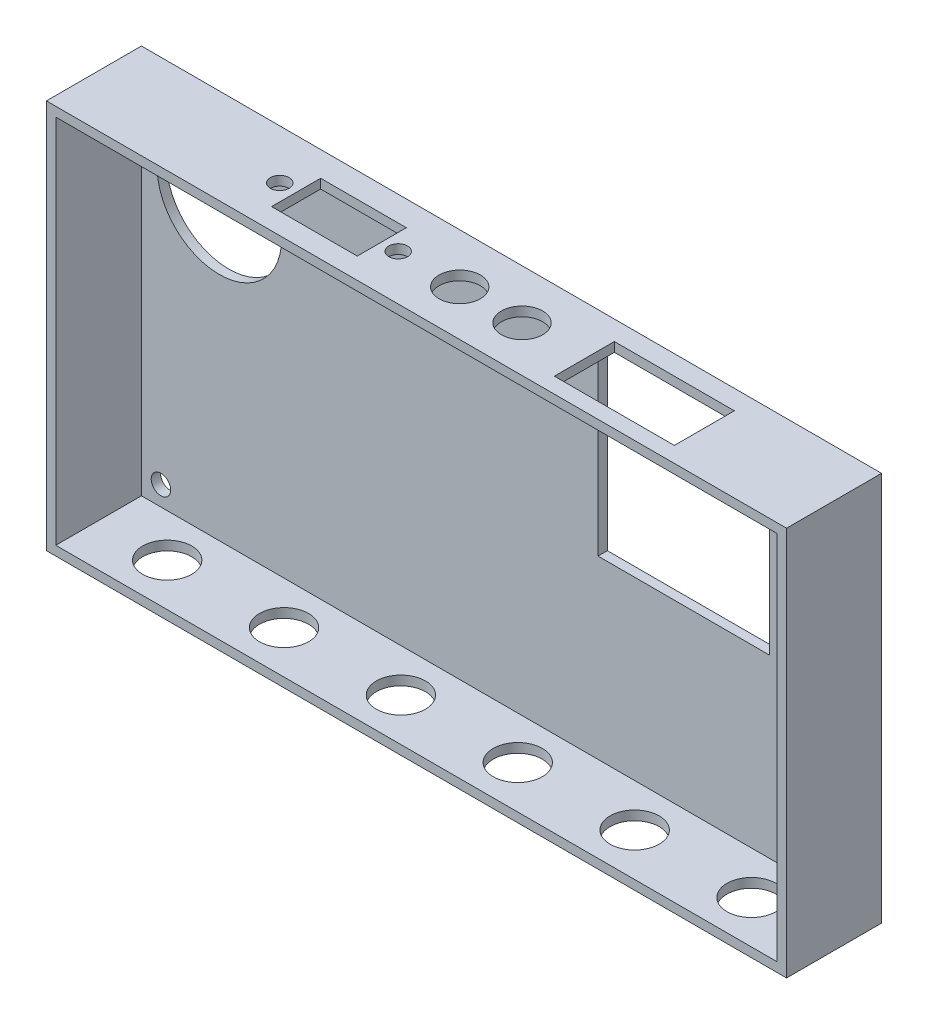
ISO-10303-21;
HEADER;
FILE_DESCRIPTION(('STEP AP214'),'2;1');
FILE_NAME('part.step','',(''),(''),'','','');
FILE_SCHEMA(('AUTOMOTIVE_DESIGN { 1 0 10303 214 1 1 1 1 }'));
ENDSEC;
DATA;
#1=APPLICATION_CONTEXT('core data for automotive mechanical design processes');
#2=APPLICATION_PROTOCOL_DEFINITION('international standard','automotive_design',2000,#1);
#3=PRODUCT_CONTEXT('',#1,'mechanical');
#4=PRODUCT('Part','Part','',(#3));
#5=PRODUCT_RELATED_PRODUCT_CATEGORY('part','',(#4));
#6=PRODUCT_DEFINITION_FORMATION('','',#4);
#7=PRODUCT_DEFINITION_CONTEXT('part definition',#1,'design');
#8=PRODUCT_DEFINITION('design','',#6,#7);
#9=PRODUCT_DEFINITION_SHAPE('','',#8);
#10=(LENGTH_UNIT() NAMED_UNIT(*) SI_UNIT(.MILLI.,.METRE.));
#11=(NAMED_UNIT(*) PLANE_ANGLE_UNIT() SI_UNIT($,.RADIAN.));
#12=(NAMED_UNIT(*) SI_UNIT($,.STERADIAN.) SOLID_ANGLE_UNIT());
#13=UNCERTAINTY_MEASURE_WITH_UNIT(LENGTH_MEASURE(1.E-05),#10,'distance_accuracy_value','');
#14=(GEOMETRIC_REPRESENTATION_CONTEXT(3) GLOBAL_UNCERTAINTY_ASSIGNED_CONTEXT((#13)) GLOBAL_UNIT_ASSIGNED_CONTEXT((#10,
#11,#12)) REPRESENTATION_CONTEXT('',''));
#15=CARTESIAN_POINT('',(0.,0.,0.));
#16=DIRECTION('',(0.,0.,1.));
#17=DIRECTION('',(1.,0.,0.));
#18=AXIS2_PLACEMENT_3D('',#15,#16,#17);
#19=CARTESIAN_POINT('',(0.,0.,1.2));
#20=DIRECTION('',(0.,0.,-1.));
#21=DIRECTION('',(-1.,0.,0.));
#22=AXIS2_PLACEMENT_3D('',#19,#20,#21);
#23=PLANE('',#22);
#24=CARTESIAN_POINT('',(11.2,-11.2,1.2));
#25=DIRECTION('',(0.,0.,1.));
#26=DIRECTION('',(1.,0.,0.));
#27=AXIS2_PLACEMENT_3D('',#24,#25,#26);
#28=CIRCLE('',#27,8.);
#29=CARTESIAN_POINT('',(19.2,-11.2,1.2));
#30=VERTEX_POINT('',#29);
#31=EDGE_CURVE('E353',#30,#30,#28,.T.);
#32=ORIENTED_EDGE('',*,*,#31,.F.);
#33=EDGE_LOOP('',(#32));
#34=FACE_BOUND('',#33,.T.);
#35=CARTESIAN_POINT('',(3.69999999999999,-46.3,1.2));
#36=DIRECTION('',(0.,0.,1.));
#37=DIRECTION('',(1.,0.,0.));
#38=AXIS2_PLACEMENT_3D('',#35,#36,#37);
#39=CIRCLE('',#38,1.25);
#40=CARTESIAN_POINT('',(4.94999999999999,-46.3,1.2));
#41=VERTEX_POINT('',#40);
#42=EDGE_CURVE('E385',#41,#41,#39,.T.);
#43=ORIENTED_EDGE('',*,*,#42,.F.);
#44=EDGE_LOOP('',(#43));
#45=FACE_BOUND('',#44,.T.);
#46=CARTESIAN_POINT('',(91.2999999999998,-46.3,1.2));
#47=DIRECTION('',(0.,0.,1.));
#48=DIRECTION('',(1.,0.,0.));
#49=AXIS2_PLACEMENT_3D('',#46,#47,#48);
#50=CIRCLE('',#49,1.25);
#51=CARTESIAN_POINT('',(92.5499999999998,-46.3,1.2));
#52=VERTEX_POINT('',#51);
#53=EDGE_CURVE('E379',#52,#52,#50,.T.);
#54=ORIENTED_EDGE('',*,*,#53,.F.);
#55=EDGE_LOOP('',(#54));
#56=FACE_BOUND('',#55,.T.);
#57=CARTESIAN_POINT('',(91.2999999999998,-3.7,1.2));
#58=DIRECTION('',(0.,0.,1.));
#59=DIRECTION('',(1.,0.,0.));
#60=AXIS2_PLACEMENT_3D('',#57,#58,#59);
#61=CIRCLE('',#60,1.25);
#62=CARTESIAN_POINT('',(92.5499999999998,-3.7,1.2));
#63=VERTEX_POINT('',#62);
#64=EDGE_CURVE('E373',#63,#63,#61,.T.);
#65=ORIENTED_EDGE('',*,*,#64,.F.);
#66=EDGE_LOOP('',(#65));
#67=FACE_BOUND('',#66,.T.);
#68=CARTESIAN_POINT('',(3.69999999999999,-3.7,1.2));
#69=DIRECTION('',(0.,0.,1.));
#70=DIRECTION('',(1.,0.,0.));
#71=AXIS2_PLACEMENT_3D('',#68,#69,#70);
#72=CIRCLE('',#71,1.2);
#73=CARTESIAN_POINT('',(4.9,-3.7,1.2));
#74=VERTEX_POINT('',#73);
#75=EDGE_CURVE('E190',#74,#74,#72,.T.);
#76=ORIENTED_EDGE('',*,*,#75,.F.);
#77=EDGE_LOOP('',(#76));
#78=FACE_BOUND('',#77,.T.);
#79=DIRECTION('',(0.,-1.,0.));
#80=VECTOR('',#79,1.);
#81=CARTESIAN_POINT('',(59.7999999999998,0.,1.2));
#82=LINE('',#81,#80);
#83=CARTESIAN_POINT('',(59.7999999999998,-1.2,1.2));
#84=VERTEX_POINT('',#83);
#85=CARTESIAN_POINT('',(59.7999999999998,-26.2,1.2));
#86=VERTEX_POINT('',#85);
#87=EDGE_CURVE('E352',#84,#86,#82,.T.);
#88=ORIENTED_EDGE('',*,*,#87,.F.);
#89=DIRECTION('',(-1.,0.,0.));
#90=VECTOR('',#89,1.);
#91=CARTESIAN_POINT('',(1.2,-1.2,1.2));
#92=LINE('',#91,#90);
#93=CARTESIAN_POINT('',(1.2,-1.2,1.2));
#94=VERTEX_POINT('',#93);
#95=EDGE_CURVE('E202',#84,#94,#92,.T.);
#96=ORIENTED_EDGE('',*,*,#95,.T.);
#97=DIRECTION('',(0.,-1.,0.));
#98=VECTOR('',#97,1.);
#99=CARTESIAN_POINT('',(1.2,-1.2,1.2));
#100=LINE('',#99,#98);
#101=CARTESIAN_POINT('',(1.19999999999982,-48.8,1.2));
#102=VERTEX_POINT('',#101);
#103=EDGE_CURVE('E320',#94,#102,#100,.T.);
#104=ORIENTED_EDGE('',*,*,#103,.T.);
#105=DIRECTION('',(1.,0.,0.));
#106=VECTOR('',#105,1.);
#107=CARTESIAN_POINT('',(1.19999999999982,-48.8,1.2));
#108=LINE('',#107,#106);
#109=CARTESIAN_POINT('',(93.7999999999998,-48.8,1.2));
#110=VERTEX_POINT('',#109);
#111=EDGE_CURVE('E333',#102,#110,#108,.T.);
#112=ORIENTED_EDGE('',*,*,#111,.T.);
#113=DIRECTION('',(0.,1.,0.));
#114=VECTOR('',#113,1.);
#115=CARTESIAN_POINT('',(93.7999999999997,-1.2,1.2));
#116=LINE('',#115,#114);
#117=CARTESIAN_POINT('',(93.7999999999997,-1.2,1.2));
#118=VERTEX_POINT('',#117);
#119=EDGE_CURVE('E200',#110,#118,#116,.T.);
#120=ORIENTED_EDGE('',*,*,#119,.T.);
#121=CARTESIAN_POINT('',(81.7999999999998,-1.2,1.2));
#122=VERTEX_POINT('',#121);
#123=EDGE_CURVE('E183',#118,#122,#92,.T.);
#124=ORIENTED_EDGE('',*,*,#123,.T.);
#125=DIRECTION('',(0.,-1.,0.));
#126=VECTOR('',#125,1.);
#127=CARTESIAN_POINT('',(81.7999999999998,0.,1.2));
#128=LINE('',#127,#126);
#129=CARTESIAN_POINT('',(81.7999999999998,-26.2,1.2));
#130=VERTEX_POINT('',#129);
#131=EDGE_CURVE('E193',#122,#130,#128,.T.);
#132=ORIENTED_EDGE('',*,*,#131,.T.);
#133=DIRECTION('',(-1.,0.,0.));
#134=VECTOR('',#133,1.);
#135=CARTESIAN_POINT('',(0.,-26.2,1.2));
#136=LINE('',#135,#134);
#137=EDGE_CURVE('E56',#130,#86,#136,.T.);
#138=ORIENTED_EDGE('',*,*,#137,.T.);
#139=EDGE_LOOP('',(#88,#96,#104,#112,#120,#124,#132,#138));
#140=FACE_BOUND('',#139,.T.);
#141=ADVANCED_FACE('F39',(#34,#45,#56,#67,#78,#140),#23,.F.);
#142=CARTESIAN_POINT('',(0.,0.,12.2));
#143=DIRECTION('',(0.,0.,1.));
#144=DIRECTION('',(1.,0.,0.));
#145=AXIS2_PLACEMENT_3D('',#142,#143,#144);
#146=PLANE('',#145);
#147=DIRECTION('',(0.,-1.,0.));
#148=VECTOR('',#147,1.);
#149=CARTESIAN_POINT('',(0.,0.,12.2));
#150=LINE('',#149,#148);
#151=CARTESIAN_POINT('',(0.,0.,12.2));
#152=VERTEX_POINT('',#151);
#153=CARTESIAN_POINT('',(-1.85676297188408E-13,-50.,12.2));
#154=VERTEX_POINT('',#153);
#155=EDGE_CURVE('E220',#152,#154,#150,.T.);
#156=ORIENTED_EDGE('',*,*,#155,.T.);
#157=DIRECTION('',(1.,0.,0.));
#158=VECTOR('',#157,1.);
#159=CARTESIAN_POINT('',(-1.85676297188408E-13,-50.,12.2));
#160=LINE('',#159,#158);
#161=CARTESIAN_POINT('',(94.9999999999998,-50.,12.2));
#162=VERTEX_POINT('',#161);
#163=EDGE_CURVE('E223',#154,#162,#160,.T.);
#164=ORIENTED_EDGE('',*,*,#163,.T.);
#165=DIRECTION('',(0.,1.,0.));
#166=VECTOR('',#165,1.);
#167=CARTESIAN_POINT('',(94.9999999999997,0.,12.2));
#168=LINE('',#167,#166);
#169=CARTESIAN_POINT('',(94.9999999999997,0.,12.2));
#170=VERTEX_POINT('',#169);
#171=EDGE_CURVE('E225',#162,#170,#168,.T.);
#172=ORIENTED_EDGE('',*,*,#171,.T.);
#173=DIRECTION('',(-1.,0.,0.));
#174=VECTOR('',#173,1.);
#175=CARTESIAN_POINT('',(0.,0.,12.2));
#176=LINE('',#175,#174);
#177=EDGE_CURVE('E227',#170,#152,#176,.T.);
#178=ORIENTED_EDGE('',*,*,#177,.T.);
#179=EDGE_LOOP('',(#156,#164,#172,#178));
#180=FACE_BOUND('',#179,.T.);
#181=DIRECTION('',(1.,0.,0.));
#182=VECTOR('',#181,1.);
#183=CARTESIAN_POINT('',(1.19999999999982,-48.8,12.2));
#184=LINE('',#183,#182);
#185=CARTESIAN_POINT('',(1.19999999999982,-48.8,12.2));
#186=VERTEX_POINT('',#185);
#187=CARTESIAN_POINT('',(93.7999999999998,-48.8,12.2));
#188=VERTEX_POINT('',#187);
#189=EDGE_CURVE('E204',#186,#188,#184,.T.);
#190=ORIENTED_EDGE('',*,*,#189,.F.);
#191=DIRECTION('',(0.,-1.,0.));
#192=VECTOR('',#191,1.);
#193=CARTESIAN_POINT('',(1.2,-1.2,12.2));
#194=LINE('',#193,#192);
#195=CARTESIAN_POINT('',(1.2,-1.2,12.2));
#196=VERTEX_POINT('',#195);
#197=EDGE_CURVE('E201',#196,#186,#194,.T.);
#198=ORIENTED_EDGE('',*,*,#197,.F.);
#199=DIRECTION('',(-1.,0.,0.));
#200=VECTOR('',#199,1.);
#201=CARTESIAN_POINT('',(1.2,-1.2,12.2));
#202=LINE('',#201,#200);
#203=CARTESIAN_POINT('',(93.7999999999997,-1.2,12.2));
#204=VERTEX_POINT('',#203);
#205=EDGE_CURVE('E213',#204,#196,#202,.T.);
#206=ORIENTED_EDGE('',*,*,#205,.F.);
#207=DIRECTION('',(0.,1.,0.));
#208=VECTOR('',#207,1.);
#209=CARTESIAN_POINT('',(93.7999999999997,-1.2,12.2));
#210=LINE('',#209,#208);
#211=EDGE_CURVE('E328',#188,#204,#210,.T.);
#212=ORIENTED_EDGE('',*,*,#211,.F.);
#213=EDGE_LOOP('',(#190,#198,#206,#212));
#214=FACE_BOUND('',#213,.T.);
#215=ADVANCED_FACE('F346',(#180,#214),#146,.T.);
#216=CARTESIAN_POINT('',(0.,0.,12.2));
#217=DIRECTION('',(1.,0.,0.));
#218=DIRECTION('',(0.,1.,0.));
#219=AXIS2_PLACEMENT_3D('',#216,#217,#218);
#220=PLANE('',#219);
#221=DIRECTION('',(0.,0.,-1.));
#222=VECTOR('',#221,1.);
#223=CARTESIAN_POINT('',(0.,0.,12.2));
#224=LINE('',#223,#222);
#225=CARTESIAN_POINT('',(-1.85676297188408E-13,0.,0.));
#226=VERTEX_POINT('',#225);
#227=EDGE_CURVE('E229',#152,#226,#224,.T.);
#228=ORIENTED_EDGE('',*,*,#227,.T.);
#229=DIRECTION('',(0.,1.,0.));
#230=VECTOR('',#229,1.);
#231=CARTESIAN_POINT('',(-1.85676297188408E-13,-50.,0.));
#232=LINE('',#231,#230);
#233=CARTESIAN_POINT('',(-1.85676297188408E-13,-50.,0.));
#234=VERTEX_POINT('',#233);
#235=EDGE_CURVE('E387',#234,#226,#232,.T.);
#236=ORIENTED_EDGE('',*,*,#235,.F.);
#237=DIRECTION('',(0.,0.,-1.));
#238=VECTOR('',#237,1.);
#239=CARTESIAN_POINT('',(-1.85676297188408E-13,-50.,12.2));
#240=LINE('',#239,#238);
#241=EDGE_CURVE('E12',#154,#234,#240,.T.);
#242=ORIENTED_EDGE('',*,*,#241,.F.);
#243=ORIENTED_EDGE('',*,*,#155,.F.);
#244=EDGE_LOOP('',(#228,#236,#242,#243));
#245=FACE_BOUND('',#244,.T.);
#246=ADVANCED_FACE('F41',(#245),#220,.F.);
#247=CARTESIAN_POINT('',(-1.85676297188408E-13,-50.,12.2));
#248=DIRECTION('',(0.,1.,0.));
#249=DIRECTION('',(-1.,0.,0.));
#250=AXIS2_PLACEMENT_3D('',#247,#248,#249);
#251=PLANE('',#250);
#252=CARTESIAN_POINT('',(9.99999999999966,-50.,6.7));
#253=DIRECTION('',(0.,-1.,0.));
#254=DIRECTION('',(0.,0.,-1.));
#255=AXIS2_PLACEMENT_3D('',#252,#253,#254);
#256=CIRCLE('',#255,3.15);
#257=CARTESIAN_POINT('',(9.99999999999966,-50.,3.55));
#258=VERTEX_POINT('',#257);
#259=EDGE_CURVE('E400',#258,#258,#256,.T.);
#260=ORIENTED_EDGE('',*,*,#259,.F.);
#261=EDGE_LOOP('',(#260));
#262=FACE_BOUND('',#261,.T.);
#263=CARTESIAN_POINT('',(84.9999999999997,-50.,6.70000000000001));
#264=DIRECTION('',(0.,-1.,0.));
#265=DIRECTION('',(0.,0.,-1.));
#266=AXIS2_PLACEMENT_3D('',#263,#264,#265);
#267=CIRCLE('',#266,3.15);
#268=CARTESIAN_POINT('',(84.9999999999997,-50.,3.55000000000001));
#269=VERTEX_POINT('',#268);
#270=EDGE_CURVE('E410',#269,#269,#267,.T.);
#271=ORIENTED_EDGE('',*,*,#270,.F.);
#272=EDGE_LOOP('',(#271));
#273=FACE_BOUND('',#272,.T.);
#274=CARTESIAN_POINT('',(69.9999999999997,-50.,6.7));
#275=DIRECTION('',(0.,-1.,0.));
#276=DIRECTION('',(0.,0.,-1.));
#277=AXIS2_PLACEMENT_3D('',#274,#275,#276);
#278=CIRCLE('',#277,3.15);
#279=CARTESIAN_POINT('',(69.9999999999997,-50.,3.55));
#280=VERTEX_POINT('',#279);
#281=EDGE_CURVE('E407',#280,#280,#278,.T.);
#282=ORIENTED_EDGE('',*,*,#281,.F.);
#283=EDGE_LOOP('',(#282));
#284=FACE_BOUND('',#283,.T.);
#285=CARTESIAN_POINT('',(54.9999999999997,-50.,6.7));
#286=DIRECTION('',(0.,-1.,0.));
#287=DIRECTION('',(0.,0.,-1.));
#288=AXIS2_PLACEMENT_3D('',#285,#286,#287);
#289=CIRCLE('',#288,3.15);
#290=CARTESIAN_POINT('',(54.9999999999997,-50.,3.55));
#291=VERTEX_POINT('',#290);
#292=EDGE_CURVE('E404',#291,#291,#289,.T.);
#293=ORIENTED_EDGE('',*,*,#292,.F.);
#294=EDGE_LOOP('',(#293));
#295=FACE_BOUND('',#294,.T.);
#296=CARTESIAN_POINT('',(39.9999999999997,-50.,6.7));
#297=DIRECTION('',(0.,-1.,0.));
#298=DIRECTION('',(0.,0.,-1.));
#299=AXIS2_PLACEMENT_3D('',#296,#297,#298);
#300=CIRCLE('',#299,3.15);
#301=CARTESIAN_POINT('',(39.9999999999997,-50.,3.55));
#302=VERTEX_POINT('',#301);
#303=EDGE_CURVE('E401',#302,#302,#300,.T.);
#304=ORIENTED_EDGE('',*,*,#303,.F.);
#305=EDGE_LOOP('',(#304));
#306=FACE_BOUND('',#305,.T.);
#307=CARTESIAN_POINT('',(24.9999999999997,-50.,6.7));
#308=DIRECTION('',(0.,-1.,0.));
#309=DIRECTION('',(0.,0.,-1.));
#310=AXIS2_PLACEMENT_3D('',#307,#308,#309);
#311=CIRCLE('',#310,3.15);
#312=CARTESIAN_POINT('',(24.9999999999997,-50.,3.55));
#313=VERTEX_POINT('',#312);
#314=EDGE_CURVE('E238',#313,#313,#311,.T.);
#315=ORIENTED_EDGE('',*,*,#314,.F.);
#316=EDGE_LOOP('',(#315));
#317=FACE_BOUND('',#316,.T.);
#318=ORIENTED_EDGE('',*,*,#241,.T.);
#319=DIRECTION('',(-1.,0.,0.));
#320=VECTOR('',#319,1.);
#321=CARTESIAN_POINT('',(-1.85676297188408E-13,-50.,0.));
#322=LINE('',#321,#320);
#323=CARTESIAN_POINT('',(94.9999999999997,-50.,0.));
#324=VERTEX_POINT('',#323);
#325=EDGE_CURVE('E397',#324,#234,#322,.T.);
#326=ORIENTED_EDGE('',*,*,#325,.F.);
#327=DIRECTION('',(0.,0.,-1.));
#328=VECTOR('',#327,1.);
#329=CARTESIAN_POINT('',(94.9999999999998,-50.,12.2));
#330=LINE('',#329,#328);
#331=EDGE_CURVE('E48',#162,#324,#330,.T.);
#332=ORIENTED_EDGE('',*,*,#331,.F.);
#333=ORIENTED_EDGE('',*,*,#163,.F.);
#334=EDGE_LOOP('',(#318,#326,#332,#333));
#335=FACE_BOUND('',#334,.T.);
#336=ADVANCED_FACE('F561',(#262,#273,#284,#295,#306,#317,#335),#251,.F.);
#337=CARTESIAN_POINT('',(94.9999999999997,0.,12.2));
#338=DIRECTION('',(-1.,0.,0.));
#339=DIRECTION('',(0.,-1.,0.));
#340=AXIS2_PLACEMENT_3D('',#337,#338,#339);
#341=PLANE('',#340);
#342=ORIENTED_EDGE('',*,*,#331,.T.);
#343=DIRECTION('',(0.,-1.,0.));
#344=VECTOR('',#343,1.);
#345=CARTESIAN_POINT('',(94.9999999999997,-50.,0.));
#346=LINE('',#345,#344);
#347=CARTESIAN_POINT('',(94.9999999999997,0.,0.));
#348=VERTEX_POINT('',#347);
#349=EDGE_CURVE('E394',#348,#324,#346,.T.);
#350=ORIENTED_EDGE('',*,*,#349,.F.);
#351=DIRECTION('',(0.,0.,-1.));
#352=VECTOR('',#351,1.);
#353=CARTESIAN_POINT('',(94.9999999999997,0.,12.2));
#354=LINE('',#353,#352);
#355=EDGE_CURVE('E231',#170,#348,#354,.T.);
#356=ORIENTED_EDGE('',*,*,#355,.F.);
#357=ORIENTED_EDGE('',*,*,#171,.F.);
#358=EDGE_LOOP('',(#342,#350,#356,#357));
#359=FACE_BOUND('',#358,.T.);
#360=ADVANCED_FACE('F551',(#359),#341,.F.);
#361=CARTESIAN_POINT('',(0.,0.,12.2));
#362=DIRECTION('',(0.,-1.,0.));
#363=DIRECTION('',(1.,0.,0.));
#364=AXIS2_PLACEMENT_3D('',#361,#362,#363);
#365=PLANE('',#364);
#366=CARTESIAN_POINT('',(47.2,0.,6.35));
#367=DIRECTION('',(0.,-1.,0.));
#368=DIRECTION('',(0.,0.,-1.));
#369=AXIS2_PLACEMENT_3D('',#366,#367,#368);
#370=CIRCLE('',#369,2.65);
#371=CARTESIAN_POINT('',(47.2,0.,3.7));
#372=VERTEX_POINT('',#371);
#373=EDGE_CURVE('E294',#372,#372,#370,.T.);
#374=ORIENTED_EDGE('',*,*,#373,.T.);
#375=EDGE_LOOP('',(#374));
#376=FACE_BOUND('',#375,.T.);
#377=CARTESIAN_POINT('',(55.2,0.,6.35));
#378=DIRECTION('',(0.,-1.,0.));
#379=DIRECTION('',(0.,0.,-1.));
#380=AXIS2_PLACEMENT_3D('',#377,#378,#379);
#381=CIRCLE('',#380,2.65);
#382=CARTESIAN_POINT('',(55.2,0.,3.7));
#383=VERTEX_POINT('',#382);
#384=EDGE_CURVE('E422',#383,#383,#381,.T.);
#385=ORIENTED_EDGE('',*,*,#384,.T.);
#386=EDGE_LOOP('',(#385));
#387=FACE_BOUND('',#386,.T.);
#388=DIRECTION('',(-1.,0.,0.));
#389=VECTOR('',#388,1.);
#390=CARTESIAN_POINT('',(63.2,0.,10.2));
#391=LINE('',#390,#389);
#392=CARTESIAN_POINT('',(78.6,0.,10.2));
#393=VERTEX_POINT('',#392);
#394=CARTESIAN_POINT('',(63.2,0.,10.2));
#395=VERTEX_POINT('',#394);
#396=EDGE_CURVE('E263',#393,#395,#391,.T.);
#397=ORIENTED_EDGE('',*,*,#396,.T.);
#398=DIRECTION('',(0.,0.,-1.));
#399=VECTOR('',#398,1.);
#400=CARTESIAN_POINT('',(63.2,0.,2.5));
#401=LINE('',#400,#399);
#402=CARTESIAN_POINT('',(63.2,0.,2.5));
#403=VERTEX_POINT('',#402);
#404=EDGE_CURVE('E271',#395,#403,#401,.T.);
#405=ORIENTED_EDGE('',*,*,#404,.T.);
#406=DIRECTION('',(1.,0.,0.));
#407=VECTOR('',#406,1.);
#408=CARTESIAN_POINT('',(63.2,0.,2.5));
#409=LINE('',#408,#407);
#410=CARTESIAN_POINT('',(78.6,0.,2.5));
#411=VERTEX_POINT('',#410);
#412=EDGE_CURVE('E429',#403,#411,#409,.T.);
#413=ORIENTED_EDGE('',*,*,#412,.T.);
#414=DIRECTION('',(0.,0.,1.));
#415=VECTOR('',#414,1.);
#416=CARTESIAN_POINT('',(78.6,0.,2.5));
#417=LINE('',#416,#415);
#418=EDGE_CURVE('E431',#411,#393,#417,.T.);
#419=ORIENTED_EDGE('',*,*,#418,.T.);
#420=EDGE_LOOP('',(#397,#405,#413,#419));
#421=FACE_BOUND('',#420,.T.);
#422=CARTESIAN_POINT('',(39.3,0.,6.35));
#423=DIRECTION('',(0.,-1.,0.));
#424=DIRECTION('',(0.,0.,-1.));
#425=AXIS2_PLACEMENT_3D('',#422,#423,#424);
#426=CIRCLE('',#425,1.20000000000001);
#427=CARTESIAN_POINT('',(39.3,0.,5.14999999999999));
#428=VERTEX_POINT('',#427);
#429=EDGE_CURVE('E288',#428,#428,#426,.T.);
#430=ORIENTED_EDGE('',*,*,#429,.T.);
#431=EDGE_LOOP('',(#430));
#432=FACE_BOUND('',#431,.T.);
#433=CARTESIAN_POINT('',(24.1,0.,6.35));
#434=DIRECTION('',(0.,-1.,0.));
#435=DIRECTION('',(0.,0.,-1.));
#436=AXIS2_PLACEMENT_3D('',#433,#434,#435);
#437=CIRCLE('',#436,1.2);
#438=CARTESIAN_POINT('',(24.1,0.,5.15));
#439=VERTEX_POINT('',#438);
#440=EDGE_CURVE('E281',#439,#439,#437,.T.);
#441=ORIENTED_EDGE('',*,*,#440,.T.);
#442=EDGE_LOOP('',(#441));
#443=FACE_BOUND('',#442,.T.);
#444=DIRECTION('',(-1.,0.,0.));
#445=VECTOR('',#444,1.);
#446=CARTESIAN_POINT('',(26.2,0.,9.5));
#447=LINE('',#446,#445);
#448=CARTESIAN_POINT('',(37.2,0.,9.5));
#449=VERTEX_POINT('',#448);
#450=CARTESIAN_POINT('',(26.2,0.,9.5));
#451=VERTEX_POINT('',#450);
#452=EDGE_CURVE('E305',#449,#451,#447,.T.);
#453=ORIENTED_EDGE('',*,*,#452,.T.);
#454=DIRECTION('',(0.,0.,-1.));
#455=VECTOR('',#454,1.);
#456=CARTESIAN_POINT('',(26.2,0.,3.2));
#457=LINE('',#456,#455);
#458=CARTESIAN_POINT('',(26.2,0.,3.2));
#459=VERTEX_POINT('',#458);
#460=EDGE_CURVE('E295',#451,#459,#457,.T.);
#461=ORIENTED_EDGE('',*,*,#460,.T.);
#462=DIRECTION('',(1.,0.,0.));
#463=VECTOR('',#462,1.);
#464=CARTESIAN_POINT('',(26.2,0.,3.2));
#465=LINE('',#464,#463);
#466=CARTESIAN_POINT('',(37.2,0.,3.2));
#467=VERTEX_POINT('',#466);
#468=EDGE_CURVE('E298',#459,#467,#465,.T.);
#469=ORIENTED_EDGE('',*,*,#468,.T.);
#470=DIRECTION('',(0.,0.,1.));
#471=VECTOR('',#470,1.);
#472=CARTESIAN_POINT('',(37.2,0.,3.2));
#473=LINE('',#472,#471);
#474=EDGE_CURVE('E302',#467,#449,#473,.T.);
#475=ORIENTED_EDGE('',*,*,#474,.T.);
#476=EDGE_LOOP('',(#453,#461,#469,#475));
#477=FACE_BOUND('',#476,.T.);
#478=ORIENTED_EDGE('',*,*,#355,.T.);
#479=DIRECTION('',(1.,0.,0.));
#480=VECTOR('',#479,1.);
#481=CARTESIAN_POINT('',(-1.85676297188408E-13,0.,0.));
#482=LINE('',#481,#480);
#483=EDGE_CURVE('E391',#226,#348,#482,.T.);
#484=ORIENTED_EDGE('',*,*,#483,.F.);
#485=ORIENTED_EDGE('',*,*,#227,.F.);
#486=ORIENTED_EDGE('',*,*,#177,.F.);
#487=EDGE_LOOP('',(#478,#484,#485,#486));
#488=FACE_BOUND('',#487,.T.);
#489=ADVANCED_FACE('F436',(#376,#387,#421,#432,#443,#477,#488),#365,.F.);
#490=CARTESIAN_POINT('',(1.2,-1.2,12.2));
#491=DIRECTION('',(1.,0.,0.));
#492=DIRECTION('',(0.,1.,0.));
#493=AXIS2_PLACEMENT_3D('',#490,#491,#492);
#494=PLANE('',#493);
#495=ORIENTED_EDGE('',*,*,#103,.F.);
#496=DIRECTION('',(0.,0.,-1.));
#497=VECTOR('',#496,1.);
#498=CARTESIAN_POINT('',(1.2,-1.2,12.2));
#499=LINE('',#498,#497);
#500=EDGE_CURVE('E209',#196,#94,#499,.T.);
#501=ORIENTED_EDGE('',*,*,#500,.F.);
#502=ORIENTED_EDGE('',*,*,#197,.T.);
#503=DIRECTION('',(0.,0.,-1.));
#504=VECTOR('',#503,1.);
#505=CARTESIAN_POINT('',(1.19999999999982,-48.8,12.2));
#506=LINE('',#505,#504);
#507=EDGE_CURVE('E217',#186,#102,#506,.T.);
#508=ORIENTED_EDGE('',*,*,#507,.T.);
#509=EDGE_LOOP('',(#495,#501,#502,#508));
#510=FACE_BOUND('',#509,.T.);
#511=ADVANCED_FACE('F341',(#510),#494,.T.);
#512=CARTESIAN_POINT('',(1.19999999999982,-48.8,12.2));
#513=DIRECTION('',(0.,1.,0.));
#514=DIRECTION('',(0.,0.,1.));
#515=AXIS2_PLACEMENT_3D('',#512,#513,#514);
#516=PLANE('',#515);
#517=CARTESIAN_POINT('',(9.99999999999966,-48.8,6.7));
#518=DIRECTION('',(0.,1.,0.));
#519=DIRECTION('',(0.,0.,1.));
#520=AXIS2_PLACEMENT_3D('',#517,#518,#519);
#521=CIRCLE('',#520,3.15);
#522=CARTESIAN_POINT('',(9.99999999999966,-48.8,9.85));
#523=VERTEX_POINT('',#522);
#524=EDGE_CURVE('E43',#523,#523,#521,.T.);
#525=ORIENTED_EDGE('',*,*,#524,.F.);
#526=EDGE_LOOP('',(#525));
#527=FACE_BOUND('',#526,.T.);
#528=CARTESIAN_POINT('',(84.9999999999997,-48.8,6.70000000000001));
#529=DIRECTION('',(0.,1.,0.));
#530=DIRECTION('',(0.,0.,1.));
#531=AXIS2_PLACEMENT_3D('',#528,#529,#530);
#532=CIRCLE('',#531,3.15);
#533=CARTESIAN_POINT('',(84.9999999999997,-48.8,9.85000000000001));
#534=VERTEX_POINT('',#533);
#535=EDGE_CURVE('E246',#534,#534,#532,.T.);
#536=ORIENTED_EDGE('',*,*,#535,.F.);
#537=EDGE_LOOP('',(#536));
#538=FACE_BOUND('',#537,.T.);
#539=CARTESIAN_POINT('',(69.9999999999997,-48.8,6.7));
#540=DIRECTION('',(0.,1.,0.));
#541=DIRECTION('',(0.,0.,1.));
#542=AXIS2_PLACEMENT_3D('',#539,#540,#541);
#543=CIRCLE('',#542,3.15);
#544=CARTESIAN_POINT('',(69.9999999999997,-48.8,9.85));
#545=VERTEX_POINT('',#544);
#546=EDGE_CURVE('E244',#545,#545,#543,.T.);
#547=ORIENTED_EDGE('',*,*,#546,.F.);
#548=EDGE_LOOP('',(#547));
#549=FACE_BOUND('',#548,.T.);
#550=CARTESIAN_POINT('',(54.9999999999997,-48.8,6.7));
#551=DIRECTION('',(0.,1.,0.));
#552=DIRECTION('',(0.,0.,1.));
#553=AXIS2_PLACEMENT_3D('',#550,#551,#552);
#554=CIRCLE('',#553,3.15);
#555=CARTESIAN_POINT('',(54.9999999999997,-48.8,9.85));
#556=VERTEX_POINT('',#555);
#557=EDGE_CURVE('E241',#556,#556,#554,.T.);
#558=ORIENTED_EDGE('',*,*,#557,.F.);
#559=EDGE_LOOP('',(#558));
#560=FACE_BOUND('',#559,.T.);
#561=CARTESIAN_POINT('',(39.9999999999997,-48.8,6.7));
#562=DIRECTION('',(0.,1.,0.));
#563=DIRECTION('',(0.,0.,1.));
#564=AXIS2_PLACEMENT_3D('',#561,#562,#563);
#565=CIRCLE('',#564,3.15);
#566=CARTESIAN_POINT('',(39.9999999999997,-48.8,9.85));
#567=VERTEX_POINT('',#566);
#568=EDGE_CURVE('E237',#567,#567,#565,.T.);
#569=ORIENTED_EDGE('',*,*,#568,.F.);
#570=EDGE_LOOP('',(#569));
#571=FACE_BOUND('',#570,.T.);
#572=CARTESIAN_POINT('',(24.9999999999997,-48.8,6.7));
#573=DIRECTION('',(0.,1.,0.));
#574=DIRECTION('',(0.,0.,1.));
#575=AXIS2_PLACEMENT_3D('',#572,#573,#574);
#576=CIRCLE('',#575,3.15);
#577=CARTESIAN_POINT('',(24.9999999999997,-48.8,9.85));
#578=VERTEX_POINT('',#577);
#579=EDGE_CURVE('E234',#578,#578,#576,.T.);
#580=ORIENTED_EDGE('',*,*,#579,.F.);
#581=EDGE_LOOP('',(#580));
#582=FACE_BOUND('',#581,.T.);
#583=ORIENTED_EDGE('',*,*,#111,.F.);
#584=ORIENTED_EDGE('',*,*,#507,.F.);
#585=ORIENTED_EDGE('',*,*,#189,.T.);
#586=DIRECTION('',(0.,0.,-1.));
#587=VECTOR('',#586,1.);
#588=CARTESIAN_POINT('',(93.7999999999998,-48.8,12.2));
#589=LINE('',#588,#587);
#590=EDGE_CURVE('E215',#188,#110,#589,.T.);
#591=ORIENTED_EDGE('',*,*,#590,.T.);
#592=EDGE_LOOP('',(#583,#584,#585,#591));
#593=FACE_BOUND('',#592,.T.);
#594=ADVANCED_FACE('F337',(#527,#538,#549,#560,#571,#582,#593),#516,.T.);
#595=CARTESIAN_POINT('',(93.7999999999997,-1.2,12.2));
#596=DIRECTION('',(-1.,0.,0.));
#597=DIRECTION('',(0.,-1.,0.));
#598=AXIS2_PLACEMENT_3D('',#595,#596,#597);
#599=PLANE('',#598);
#600=ORIENTED_EDGE('',*,*,#119,.F.);
#601=ORIENTED_EDGE('',*,*,#590,.F.);
#602=ORIENTED_EDGE('',*,*,#211,.T.);
#603=DIRECTION('',(0.,0.,-1.));
#604=VECTOR('',#603,1.);
#605=CARTESIAN_POINT('',(93.7999999999997,-1.2,12.2));
#606=LINE('',#605,#604);
#607=EDGE_CURVE('E212',#204,#118,#606,.T.);
#608=ORIENTED_EDGE('',*,*,#607,.T.);
#609=EDGE_LOOP('',(#600,#601,#602,#608));
#610=FACE_BOUND('',#609,.T.);
#611=ADVANCED_FACE('F349',(#610),#599,.T.);
#612=CARTESIAN_POINT('',(1.2,-1.2,12.2));
#613=DIRECTION('',(0.,-1.,0.));
#614=DIRECTION('',(0.,0.,-1.));
#615=AXIS2_PLACEMENT_3D('',#612,#613,#614);
#616=PLANE('',#615);
#617=CARTESIAN_POINT('',(47.2,-1.2,6.35));
#618=DIRECTION('',(0.,-1.,0.));
#619=DIRECTION('',(0.,0.,-1.));
#620=AXIS2_PLACEMENT_3D('',#617,#618,#619);
#621=CIRCLE('',#620,2.65);
#622=CARTESIAN_POINT('',(47.2,-1.2,3.7));
#623=VERTEX_POINT('',#622);
#624=EDGE_CURVE('E419',#623,#623,#621,.T.);
#625=ORIENTED_EDGE('',*,*,#624,.F.);
#626=EDGE_LOOP('',(#625));
#627=FACE_BOUND('',#626,.T.);
#628=CARTESIAN_POINT('',(55.2,-1.2,6.35));
#629=DIRECTION('',(0.,-1.,0.));
#630=DIRECTION('',(0.,0.,-1.));
#631=AXIS2_PLACEMENT_3D('',#628,#629,#630);
#632=CIRCLE('',#631,2.65);
#633=CARTESIAN_POINT('',(55.2,-1.2,3.7));
#634=VERTEX_POINT('',#633);
#635=EDGE_CURVE('E274',#634,#634,#632,.T.);
#636=ORIENTED_EDGE('',*,*,#635,.F.);
#637=EDGE_LOOP('',(#636));
#638=FACE_BOUND('',#637,.T.);
#639=DIRECTION('',(0.,0.,-1.));
#640=VECTOR('',#639,1.);
#641=CARTESIAN_POINT('',(63.2,-1.2,2.5));
#642=LINE('',#641,#640);
#643=CARTESIAN_POINT('',(63.2,-1.2,10.2));
#644=VERTEX_POINT('',#643);
#645=CARTESIAN_POINT('',(63.2,-1.2,2.5));
#646=VERTEX_POINT('',#645);
#647=EDGE_CURVE('E251',#644,#646,#642,.T.);
#648=ORIENTED_EDGE('',*,*,#647,.F.);
#649=DIRECTION('',(-1.,0.,0.));
#650=VECTOR('',#649,1.);
#651=CARTESIAN_POINT('',(63.2,-1.2,10.2));
#652=LINE('',#651,#650);
#653=CARTESIAN_POINT('',(78.6,-1.2,10.2));
#654=VERTEX_POINT('',#653);
#655=EDGE_CURVE('E268',#654,#644,#652,.T.);
#656=ORIENTED_EDGE('',*,*,#655,.F.);
#657=DIRECTION('',(0.,0.,1.));
#658=VECTOR('',#657,1.);
#659=CARTESIAN_POINT('',(78.6,-1.2,2.5));
#660=LINE('',#659,#658);
#661=CARTESIAN_POINT('',(78.6,-1.2,2.5));
#662=VERTEX_POINT('',#661);
#663=EDGE_CURVE('E260',#662,#654,#660,.T.);
#664=ORIENTED_EDGE('',*,*,#663,.F.);
#665=DIRECTION('',(1.,0.,0.));
#666=VECTOR('',#665,1.);
#667=CARTESIAN_POINT('',(63.2,-1.2,2.5));
#668=LINE('',#667,#666);
#669=EDGE_CURVE('E254',#646,#662,#668,.T.);
#670=ORIENTED_EDGE('',*,*,#669,.F.);
#671=EDGE_LOOP('',(#648,#656,#664,#670));
#672=FACE_BOUND('',#671,.T.);
#673=CARTESIAN_POINT('',(39.3,-1.2,6.35));
#674=DIRECTION('',(0.,-1.,0.));
#675=DIRECTION('',(0.,0.,-1.));
#676=AXIS2_PLACEMENT_3D('',#673,#674,#675);
#677=CIRCLE('',#676,1.20000000000001);
#678=CARTESIAN_POINT('',(39.3,-1.2,5.14999999999999));
#679=VERTEX_POINT('',#678);
#680=EDGE_CURVE('E291',#679,#679,#677,.T.);
#681=ORIENTED_EDGE('',*,*,#680,.F.);
#682=EDGE_LOOP('',(#681));
#683=FACE_BOUND('',#682,.T.);
#684=CARTESIAN_POINT('',(24.1,-1.2,6.35));
#685=DIRECTION('',(0.,-1.,0.));
#686=DIRECTION('',(0.,0.,-1.));
#687=AXIS2_PLACEMENT_3D('',#684,#685,#686);
#688=CIRCLE('',#687,1.2);
#689=CARTESIAN_POINT('',(24.1,-1.2,5.15));
#690=VERTEX_POINT('',#689);
#691=EDGE_CURVE('E285',#690,#690,#688,.T.);
#692=ORIENTED_EDGE('',*,*,#691,.F.);
#693=EDGE_LOOP('',(#692));
#694=FACE_BOUND('',#693,.T.);
#695=DIRECTION('',(0.,0.,-1.));
#696=VECTOR('',#695,1.);
#697=CARTESIAN_POINT('',(26.2,-1.2,3.2));
#698=LINE('',#697,#696);
#699=CARTESIAN_POINT('',(26.2,-1.2,9.5));
#700=VERTEX_POINT('',#699);
#701=CARTESIAN_POINT('',(26.2,-1.2,3.2));
#702=VERTEX_POINT('',#701);
#703=EDGE_CURVE('E284',#700,#702,#698,.T.);
#704=ORIENTED_EDGE('',*,*,#703,.F.);
#705=DIRECTION('',(-1.,0.,0.));
#706=VECTOR('',#705,1.);
#707=CARTESIAN_POINT('',(26.2,-1.2,9.5));
#708=LINE('',#707,#706);
#709=CARTESIAN_POINT('',(37.2,-1.2,9.5));
#710=VERTEX_POINT('',#709);
#711=EDGE_CURVE('E299',#710,#700,#708,.T.);
#712=ORIENTED_EDGE('',*,*,#711,.F.);
#713=DIRECTION('',(0.,0.,1.));
#714=VECTOR('',#713,1.);
#715=CARTESIAN_POINT('',(37.2,-1.2,3.2));
#716=LINE('',#715,#714);
#717=CARTESIAN_POINT('',(37.2,-1.2,3.2));
#718=VERTEX_POINT('',#717);
#719=EDGE_CURVE('E313',#718,#710,#716,.T.);
#720=ORIENTED_EDGE('',*,*,#719,.F.);
#721=DIRECTION('',(1.,0.,0.));
#722=VECTOR('',#721,1.);
#723=CARTESIAN_POINT('',(26.2,-1.2,3.2));
#724=LINE('',#723,#722);
#725=EDGE_CURVE('E310',#702,#718,#724,.T.);
#726=ORIENTED_EDGE('',*,*,#725,.F.);
#727=EDGE_LOOP('',(#704,#712,#720,#726));
#728=FACE_BOUND('',#727,.T.);
#729=ORIENTED_EDGE('',*,*,#123,.F.);
#730=ORIENTED_EDGE('',*,*,#607,.F.);
#731=ORIENTED_EDGE('',*,*,#205,.T.);
#732=ORIENTED_EDGE('',*,*,#500,.T.);
#733=ORIENTED_EDGE('',*,*,#95,.F.);
#734=DIRECTION('',(0.,0.,1.));
#735=VECTOR('',#734,1.);
#736=CARTESIAN_POINT('',(59.7999999999998,-1.2,0.));
#737=LINE('',#736,#735);
#738=CARTESIAN_POINT('',(59.7999999999998,-1.2,0.));
#739=VERTEX_POINT('',#738);
#740=EDGE_CURVE('E351',#739,#84,#737,.T.);
#741=ORIENTED_EDGE('',*,*,#740,.F.);
#742=DIRECTION('',(-1.,0.,0.));
#743=VECTOR('',#742,1.);
#744=CARTESIAN_POINT('',(0.,-1.2,0.));
#745=LINE('',#744,#743);
#746=CARTESIAN_POINT('',(81.7999999999998,-1.2,0.));
#747=VERTEX_POINT('',#746);
#748=EDGE_CURVE('E186',#747,#739,#745,.T.);
#749=ORIENTED_EDGE('',*,*,#748,.F.);
#750=DIRECTION('',(0.,0.,1.));
#751=VECTOR('',#750,1.);
#752=CARTESIAN_POINT('',(81.7999999999998,-1.2,0.));
#753=LINE('',#752,#751);
#754=EDGE_CURVE('E179',#747,#122,#753,.T.);
#755=ORIENTED_EDGE('',*,*,#754,.T.);
#756=EDGE_LOOP('',(#729,#730,#731,#732,#733,#741,#749,#755));
#757=FACE_BOUND('',#756,.T.);
#758=ADVANCED_FACE('F181',(#627,#638,#672,#683,#694,#728,#757),#616,.T.);
#759=CARTESIAN_POINT('',(26.2,0.,3.2));
#760=DIRECTION('',(-1.,0.,0.));
#761=DIRECTION('',(0.,0.,1.));
#762=AXIS2_PLACEMENT_3D('',#759,#760,#761);
#763=PLANE('',#762);
#764=ORIENTED_EDGE('',*,*,#703,.T.);
#765=DIRECTION('',(0.,-1.,0.));
#766=VECTOR('',#765,1.);
#767=CARTESIAN_POINT('',(26.2,0.,3.2));
#768=LINE('',#767,#766);
#769=EDGE_CURVE('E308',#459,#702,#768,.T.);
#770=ORIENTED_EDGE('',*,*,#769,.F.);
#771=ORIENTED_EDGE('',*,*,#460,.F.);
#772=DIRECTION('',(0.,-1.,0.));
#773=VECTOR('',#772,1.);
#774=CARTESIAN_POINT('',(26.2,0.,9.5));
#775=LINE('',#774,#773);
#776=EDGE_CURVE('E318',#451,#700,#775,.T.);
#777=ORIENTED_EDGE('',*,*,#776,.T.);
#778=EDGE_LOOP('',(#764,#770,#771,#777));
#779=FACE_BOUND('',#778,.T.);
#780=ADVANCED_FACE('F454',(#779),#763,.F.);
#781=CARTESIAN_POINT('',(26.2,0.,9.5));
#782=DIRECTION('',(0.,0.,1.));
#783=DIRECTION('',(1.,0.,0.));
#784=AXIS2_PLACEMENT_3D('',#781,#782,#783);
#785=PLANE('',#784);
#786=ORIENTED_EDGE('',*,*,#711,.T.);
#787=ORIENTED_EDGE('',*,*,#776,.F.);
#788=ORIENTED_EDGE('',*,*,#452,.F.);
#789=DIRECTION('',(0.,-1.,0.));
#790=VECTOR('',#789,1.);
#791=CARTESIAN_POINT('',(37.2,0.,9.5));
#792=LINE('',#791,#790);
#793=EDGE_CURVE('E321',#449,#710,#792,.T.);
#794=ORIENTED_EDGE('',*,*,#793,.T.);
#795=EDGE_LOOP('',(#786,#787,#788,#794));
#796=FACE_BOUND('',#795,.T.);
#797=ADVANCED_FACE('F475',(#796),#785,.F.);
#798=CARTESIAN_POINT('',(37.2,0.,3.2));
#799=DIRECTION('',(1.,0.,0.));
#800=DIRECTION('',(0.,0.,-1.));
#801=AXIS2_PLACEMENT_3D('',#798,#799,#800);
#802=PLANE('',#801);
#803=ORIENTED_EDGE('',*,*,#719,.T.);
#804=ORIENTED_EDGE('',*,*,#793,.F.);
#805=ORIENTED_EDGE('',*,*,#474,.F.);
#806=DIRECTION('',(0.,-1.,0.));
#807=VECTOR('',#806,1.);
#808=CARTESIAN_POINT('',(37.2,0.,3.2));
#809=LINE('',#808,#807);
#810=EDGE_CURVE('E323',#467,#718,#809,.T.);
#811=ORIENTED_EDGE('',*,*,#810,.T.);
#812=EDGE_LOOP('',(#803,#804,#805,#811));
#813=FACE_BOUND('',#812,.T.);
#814=ADVANCED_FACE('F477',(#813),#802,.F.);
#815=CARTESIAN_POINT('',(26.2,0.,3.2));
#816=DIRECTION('',(0.,0.,-1.));
#817=DIRECTION('',(-1.,0.,0.));
#818=AXIS2_PLACEMENT_3D('',#815,#816,#817);
#819=PLANE('',#818);
#820=ORIENTED_EDGE('',*,*,#725,.T.);
#821=ORIENTED_EDGE('',*,*,#810,.F.);
#822=ORIENTED_EDGE('',*,*,#468,.F.);
#823=ORIENTED_EDGE('',*,*,#769,.T.);
#824=EDGE_LOOP('',(#820,#821,#822,#823));
#825=FACE_BOUND('',#824,.T.);
#826=ADVANCED_FACE('F469',(#825),#819,.F.);
#827=CARTESIAN_POINT('',(24.1,0.,6.35));
#828=DIRECTION('',(0.,-1.,0.));
#829=DIRECTION('',(0.,0.,-1.));
#830=AXIS2_PLACEMENT_3D('',#827,#828,#829);
#831=CYLINDRICAL_SURFACE('',#830,1.2);
#832=ORIENTED_EDGE('',*,*,#440,.F.);
#833=EDGE_LOOP('',(#832));
#834=FACE_BOUND('',#833,.T.);
#835=ORIENTED_EDGE('',*,*,#691,.T.);
#836=EDGE_LOOP('',(#835));
#837=FACE_BOUND('',#836,.T.);
#838=ADVANCED_FACE('F484',(#834,#837),#831,.F.);
#839=CARTESIAN_POINT('',(39.3,0.,6.35));
#840=DIRECTION('',(0.,-1.,0.));
#841=DIRECTION('',(0.,0.,-1.));
#842=AXIS2_PLACEMENT_3D('',#839,#840,#841);
#843=CYLINDRICAL_SURFACE('',#842,1.20000000000001);
#844=ORIENTED_EDGE('',*,*,#429,.F.);
#845=EDGE_LOOP('',(#844));
#846=FACE_BOUND('',#845,.T.);
#847=ORIENTED_EDGE('',*,*,#680,.T.);
#848=EDGE_LOOP('',(#847));
#849=FACE_BOUND('',#848,.T.);
#850=ADVANCED_FACE('F539',(#846,#849),#843,.F.);
#851=CARTESIAN_POINT('',(63.2,0.,2.5));
#852=DIRECTION('',(-1.,0.,0.));
#853=DIRECTION('',(0.,0.,1.));
#854=AXIS2_PLACEMENT_3D('',#851,#852,#853);
#855=PLANE('',#854);
#856=ORIENTED_EDGE('',*,*,#647,.T.);
#857=DIRECTION('',(0.,-1.,0.));
#858=VECTOR('',#857,1.);
#859=CARTESIAN_POINT('',(63.2,0.,2.5));
#860=LINE('',#859,#858);
#861=EDGE_CURVE('E279',#403,#646,#860,.T.);
#862=ORIENTED_EDGE('',*,*,#861,.F.);
#863=ORIENTED_EDGE('',*,*,#404,.F.);
#864=DIRECTION('',(0.,-1.,0.));
#865=VECTOR('',#864,1.);
#866=CARTESIAN_POINT('',(63.2,0.,10.2));
#867=LINE('',#866,#865);
#868=EDGE_CURVE('E272',#395,#644,#867,.T.);
#869=ORIENTED_EDGE('',*,*,#868,.T.);
#870=EDGE_LOOP('',(#856,#862,#863,#869));
#871=FACE_BOUND('',#870,.T.);
#872=ADVANCED_FACE('F442',(#871),#855,.F.);
#873=CARTESIAN_POINT('',(63.2,0.,10.2));
#874=DIRECTION('',(0.,0.,1.));
#875=DIRECTION('',(1.,0.,0.));
#876=AXIS2_PLACEMENT_3D('',#873,#874,#875);
#877=PLANE('',#876);
#878=ORIENTED_EDGE('',*,*,#655,.T.);
#879=ORIENTED_EDGE('',*,*,#868,.F.);
#880=ORIENTED_EDGE('',*,*,#396,.F.);
#881=DIRECTION('',(0.,-1.,0.));
#882=VECTOR('',#881,1.);
#883=CARTESIAN_POINT('',(78.6,0.,10.2));
#884=LINE('',#883,#882);
#885=EDGE_CURVE('E275',#393,#654,#884,.T.);
#886=ORIENTED_EDGE('',*,*,#885,.T.);
#887=EDGE_LOOP('',(#878,#879,#880,#886));
#888=FACE_BOUND('',#887,.T.);
#889=ADVANCED_FACE('F440',(#888),#877,.F.);
#890=CARTESIAN_POINT('',(78.6,0.,2.5));
#891=DIRECTION('',(1.,0.,0.));
#892=DIRECTION('',(0.,0.,-1.));
#893=AXIS2_PLACEMENT_3D('',#890,#891,#892);
#894=PLANE('',#893);
#895=ORIENTED_EDGE('',*,*,#663,.T.);
#896=ORIENTED_EDGE('',*,*,#885,.F.);
#897=ORIENTED_EDGE('',*,*,#418,.F.);
#898=DIRECTION('',(0.,-1.,0.));
#899=VECTOR('',#898,1.);
#900=CARTESIAN_POINT('',(78.6,0.,2.5));
#901=LINE('',#900,#899);
#902=EDGE_CURVE('E277',#411,#662,#901,.T.);
#903=ORIENTED_EDGE('',*,*,#902,.T.);
#904=EDGE_LOOP('',(#895,#896,#897,#903));
#905=FACE_BOUND('',#904,.T.);
#906=ADVANCED_FACE('F450',(#905),#894,.F.);
#907=CARTESIAN_POINT('',(63.2,0.,2.5));
#908=DIRECTION('',(0.,0.,-1.));
#909=DIRECTION('',(-1.,0.,0.));
#910=AXIS2_PLACEMENT_3D('',#907,#908,#909);
#911=PLANE('',#910);
#912=ORIENTED_EDGE('',*,*,#669,.T.);
#913=ORIENTED_EDGE('',*,*,#902,.F.);
#914=ORIENTED_EDGE('',*,*,#412,.F.);
#915=ORIENTED_EDGE('',*,*,#861,.T.);
#916=EDGE_LOOP('',(#912,#913,#914,#915));
#917=FACE_BOUND('',#916,.T.);
#918=ADVANCED_FACE('F447',(#917),#911,.F.);
#919=CARTESIAN_POINT('',(55.2,0.,6.35));
#920=DIRECTION('',(0.,-1.,0.));
#921=DIRECTION('',(0.,0.,-1.));
#922=AXIS2_PLACEMENT_3D('',#919,#920,#921);
#923=CYLINDRICAL_SURFACE('',#922,2.65);
#924=ORIENTED_EDGE('',*,*,#384,.F.);
#925=EDGE_LOOP('',(#924));
#926=FACE_BOUND('',#925,.T.);
#927=ORIENTED_EDGE('',*,*,#635,.T.);
#928=EDGE_LOOP('',(#927));
#929=FACE_BOUND('',#928,.T.);
#930=ADVANCED_FACE('F526',(#926,#929),#923,.F.);
#931=CARTESIAN_POINT('',(47.2,0.,6.35));
#932=DIRECTION('',(0.,-1.,0.));
#933=DIRECTION('',(0.,0.,-1.));
#934=AXIS2_PLACEMENT_3D('',#931,#932,#933);
#935=CYLINDRICAL_SURFACE('',#934,2.65);
#936=ORIENTED_EDGE('',*,*,#373,.F.);
#937=EDGE_LOOP('',(#936));
#938=FACE_BOUND('',#937,.T.);
#939=ORIENTED_EDGE('',*,*,#624,.T.);
#940=EDGE_LOOP('',(#939));
#941=FACE_BOUND('',#940,.T.);
#942=ADVANCED_FACE('F522',(#938,#941),#935,.F.);
#943=CARTESIAN_POINT('',(24.9999999999997,-35.,6.7));
#944=DIRECTION('',(0.,-1.,0.));
#945=DIRECTION('',(0.,0.,-1.));
#946=AXIS2_PLACEMENT_3D('',#943,#944,#945);
#947=CYLINDRICAL_SURFACE('',#946,3.15);
#948=ORIENTED_EDGE('',*,*,#579,.T.);
#949=EDGE_LOOP('',(#948));
#950=FACE_BOUND('',#949,.T.);
#951=ORIENTED_EDGE('',*,*,#314,.T.);
#952=EDGE_LOOP('',(#951));
#953=FACE_BOUND('',#952,.T.);
#954=ADVANCED_FACE('F505',(#950,#953),#947,.F.);
#955=CARTESIAN_POINT('',(39.9999999999997,-35.,6.7));
#956=DIRECTION('',(0.,-1.,0.));
#957=DIRECTION('',(0.,0.,-1.));
#958=AXIS2_PLACEMENT_3D('',#955,#956,#957);
#959=CYLINDRICAL_SURFACE('',#958,3.15);
#960=ORIENTED_EDGE('',*,*,#568,.T.);
#961=EDGE_LOOP('',(#960));
#962=FACE_BOUND('',#961,.T.);
#963=ORIENTED_EDGE('',*,*,#303,.T.);
#964=EDGE_LOOP('',(#963));
#965=FACE_BOUND('',#964,.T.);
#966=ADVANCED_FACE('F501',(#962,#965),#959,.F.);
#967=CARTESIAN_POINT('',(54.9999999999997,-35.,6.7));
#968=DIRECTION('',(0.,-1.,0.));
#969=DIRECTION('',(0.,0.,-1.));
#970=AXIS2_PLACEMENT_3D('',#967,#968,#969);
#971=CYLINDRICAL_SURFACE('',#970,3.15);
#972=ORIENTED_EDGE('',*,*,#557,.T.);
#973=EDGE_LOOP('',(#972));
#974=FACE_BOUND('',#973,.T.);
#975=ORIENTED_EDGE('',*,*,#292,.T.);
#976=EDGE_LOOP('',(#975));
#977=FACE_BOUND('',#976,.T.);
#978=ADVANCED_FACE('F504',(#974,#977),#971,.F.);
#979=CARTESIAN_POINT('',(69.9999999999997,-35.,6.7));
#980=DIRECTION('',(0.,-1.,0.));
#981=DIRECTION('',(0.,0.,-1.));
#982=AXIS2_PLACEMENT_3D('',#979,#980,#981);
#983=CYLINDRICAL_SURFACE('',#982,3.15);
#984=ORIENTED_EDGE('',*,*,#546,.T.);
#985=EDGE_LOOP('',(#984));
#986=FACE_BOUND('',#985,.T.);
#987=ORIENTED_EDGE('',*,*,#281,.T.);
#988=EDGE_LOOP('',(#987));
#989=FACE_BOUND('',#988,.T.);
#990=ADVANCED_FACE('F509',(#986,#989),#983,.F.);
#991=CARTESIAN_POINT('',(84.9999999999997,-35.,6.70000000000001));
#992=DIRECTION('',(0.,-1.,0.));
#993=DIRECTION('',(0.,0.,-1.));
#994=AXIS2_PLACEMENT_3D('',#991,#992,#993);
#995=CYLINDRICAL_SURFACE('',#994,3.15);
#996=ORIENTED_EDGE('',*,*,#535,.T.);
#997=EDGE_LOOP('',(#996));
#998=FACE_BOUND('',#997,.T.);
#999=ORIENTED_EDGE('',*,*,#270,.T.);
#1000=EDGE_LOOP('',(#999));
#1001=FACE_BOUND('',#1000,.T.);
#1002=ADVANCED_FACE('F513',(#998,#1001),#995,.F.);
#1003=CARTESIAN_POINT('',(9.99999999999966,-35.,6.7));
#1004=DIRECTION('',(0.,-1.,0.));
#1005=DIRECTION('',(0.,0.,-1.));
#1006=AXIS2_PLACEMENT_3D('',#1003,#1004,#1005);
#1007=CYLINDRICAL_SURFACE('',#1006,3.15);
#1008=ORIENTED_EDGE('',*,*,#524,.T.);
#1009=EDGE_LOOP('',(#1008));
#1010=FACE_BOUND('',#1009,.T.);
#1011=ORIENTED_EDGE('',*,*,#259,.T.);
#1012=EDGE_LOOP('',(#1011));
#1013=FACE_BOUND('',#1012,.T.);
#1014=ADVANCED_FACE('F517',(#1010,#1013),#1007,.F.);
#1015=CARTESIAN_POINT('',(0.,0.,0.));
#1016=DIRECTION('',(0.,0.,-1.));
#1017=DIRECTION('',(-1.,0.,0.));
#1018=AXIS2_PLACEMENT_3D('',#1015,#1016,#1017);
#1019=PLANE('',#1018);
#1020=ORIENTED_EDGE('',*,*,#748,.T.);
#1021=DIRECTION('',(0.,-1.,0.));
#1022=VECTOR('',#1021,1.);
#1023=CARTESIAN_POINT('',(59.7999999999998,0.,0.));
#1024=LINE('',#1023,#1022);
#1025=CARTESIAN_POINT('',(59.7999999999998,-26.2,0.));
#1026=VERTEX_POINT('',#1025);
#1027=EDGE_CURVE('E364',#739,#1026,#1024,.T.);
#1028=ORIENTED_EDGE('',*,*,#1027,.T.);
#1029=DIRECTION('',(-1.,0.,0.));
#1030=VECTOR('',#1029,1.);
#1031=CARTESIAN_POINT('',(0.,-26.2,0.));
#1032=LINE('',#1031,#1030);
#1033=CARTESIAN_POINT('',(81.7999999999998,-26.2,0.));
#1034=VERTEX_POINT('',#1033);
#1035=EDGE_CURVE('E362',#1034,#1026,#1032,.T.);
#1036=ORIENTED_EDGE('',*,*,#1035,.F.);
#1037=DIRECTION('',(0.,-1.,0.));
#1038=VECTOR('',#1037,1.);
#1039=CARTESIAN_POINT('',(81.7999999999998,0.,0.));
#1040=LINE('',#1039,#1038);
#1041=EDGE_CURVE('E360',#747,#1034,#1040,.T.);
#1042=ORIENTED_EDGE('',*,*,#1041,.F.);
#1043=EDGE_LOOP('',(#1020,#1028,#1036,#1042));
#1044=FACE_BOUND('',#1043,.T.);
#1045=CARTESIAN_POINT('',(3.69999999999999,-3.7,0.));
#1046=DIRECTION('',(0.,0.,1.));
#1047=DIRECTION('',(1.,0.,0.));
#1048=AXIS2_PLACEMENT_3D('',#1045,#1046,#1047);
#1049=CIRCLE('',#1048,1.2);
#1050=CARTESIAN_POINT('',(4.9,-3.7,0.));
#1051=VERTEX_POINT('',#1050);
#1052=EDGE_CURVE('E370',#1051,#1051,#1049,.T.);
#1053=ORIENTED_EDGE('',*,*,#1052,.T.);
#1054=EDGE_LOOP('',(#1053));
#1055=FACE_BOUND('',#1054,.T.);
#1056=CARTESIAN_POINT('',(91.2999999999998,-3.7,0.));
#1057=DIRECTION('',(0.,0.,1.));
#1058=DIRECTION('',(1.,0.,0.));
#1059=AXIS2_PLACEMENT_3D('',#1056,#1057,#1058);
#1060=CIRCLE('',#1059,1.25);
#1061=CARTESIAN_POINT('',(92.5499999999998,-3.7,0.));
#1062=VERTEX_POINT('',#1061);
#1063=EDGE_CURVE('E376',#1062,#1062,#1060,.T.);
#1064=ORIENTED_EDGE('',*,*,#1063,.T.);
#1065=EDGE_LOOP('',(#1064));
#1066=FACE_BOUND('',#1065,.T.);
#1067=CARTESIAN_POINT('',(91.2999999999998,-46.3,0.));
#1068=DIRECTION('',(0.,0.,1.));
#1069=DIRECTION('',(1.,0.,0.));
#1070=AXIS2_PLACEMENT_3D('',#1067,#1068,#1069);
#1071=CIRCLE('',#1070,1.25);
#1072=CARTESIAN_POINT('',(92.5499999999998,-46.3,0.));
#1073=VERTEX_POINT('',#1072);
#1074=EDGE_CURVE('E382',#1073,#1073,#1071,.T.);
#1075=ORIENTED_EDGE('',*,*,#1074,.T.);
#1076=EDGE_LOOP('',(#1075));
#1077=FACE_BOUND('',#1076,.T.);
#1078=CARTESIAN_POINT('',(3.69999999999999,-46.3,0.));
#1079=DIRECTION('',(0.,0.,1.));
#1080=DIRECTION('',(1.,0.,0.));
#1081=AXIS2_PLACEMENT_3D('',#1078,#1079,#1080);
#1082=CIRCLE('',#1081,1.25);
#1083=CARTESIAN_POINT('',(4.94999999999999,-46.3,0.));
#1084=VERTEX_POINT('',#1083);
#1085=EDGE_CURVE('E613',#1084,#1084,#1082,.T.);
#1086=ORIENTED_EDGE('',*,*,#1085,.T.);
#1087=EDGE_LOOP('',(#1086));
#1088=FACE_BOUND('',#1087,.T.);
#1089=CARTESIAN_POINT('',(11.2,-11.2,0.));
#1090=DIRECTION('',(0.,0.,1.));
#1091=DIRECTION('',(1.,0.,0.));
#1092=AXIS2_PLACEMENT_3D('',#1089,#1090,#1091);
#1093=CIRCLE('',#1092,8.);
#1094=CARTESIAN_POINT('',(19.2,-11.2,0.));
#1095=VERTEX_POINT('',#1094);
#1096=EDGE_CURVE('E356',#1095,#1095,#1093,.T.);
#1097=ORIENTED_EDGE('',*,*,#1096,.T.);
#1098=EDGE_LOOP('',(#1097));
#1099=FACE_BOUND('',#1098,.T.);
#1100=ORIENTED_EDGE('',*,*,#235,.T.);
#1101=ORIENTED_EDGE('',*,*,#483,.T.);
#1102=ORIENTED_EDGE('',*,*,#349,.T.);
#1103=ORIENTED_EDGE('',*,*,#325,.T.);
#1104=EDGE_LOOP('',(#1100,#1101,#1102,#1103));
#1105=FACE_BOUND('',#1104,.T.);
#1106=ADVANCED_FACE('F499',(#1044,#1055,#1066,#1077,#1088,#1099,#1105),#1019,.T.);
#1107=CARTESIAN_POINT('',(11.2,-11.2,0.));
#1108=DIRECTION('',(0.,0.,1.));
#1109=DIRECTION('',(1.,0.,0.));
#1110=AXIS2_PLACEMENT_3D('',#1107,#1108,#1109);
#1111=CYLINDRICAL_SURFACE('',#1110,8.);
#1112=ORIENTED_EDGE('',*,*,#1096,.F.);
#1113=EDGE_LOOP('',(#1112));
#1114=FACE_BOUND('',#1113,.T.);
#1115=ORIENTED_EDGE('',*,*,#31,.T.);
#1116=EDGE_LOOP('',(#1115));
#1117=FACE_BOUND('',#1116,.T.);
#1118=ADVANCED_FACE('F596',(#1114,#1117),#1111,.F.);
#1119=CARTESIAN_POINT('',(3.69999999999999,-46.3,0.));
#1120=DIRECTION('',(0.,0.,1.));
#1121=DIRECTION('',(1.,0.,0.));
#1122=AXIS2_PLACEMENT_3D('',#1119,#1120,#1121);
#1123=CYLINDRICAL_SURFACE('',#1122,1.25);
#1124=ORIENTED_EDGE('',*,*,#1085,.F.);
#1125=EDGE_LOOP('',(#1124));
#1126=FACE_BOUND('',#1125,.T.);
#1127=ORIENTED_EDGE('',*,*,#42,.T.);
#1128=EDGE_LOOP('',(#1127));
#1129=FACE_BOUND('',#1128,.T.);
#1130=ADVANCED_FACE('F601',(#1126,#1129),#1123,.F.);
#1131=CARTESIAN_POINT('',(91.2999999999998,-46.3,0.));
#1132=DIRECTION('',(0.,0.,1.));
#1133=DIRECTION('',(1.,0.,0.));
#1134=AXIS2_PLACEMENT_3D('',#1131,#1132,#1133);
#1135=CYLINDRICAL_SURFACE('',#1134,1.25);
#1136=ORIENTED_EDGE('',*,*,#1074,.F.);
#1137=EDGE_LOOP('',(#1136));
#1138=FACE_BOUND('',#1137,.T.);
#1139=ORIENTED_EDGE('',*,*,#53,.T.);
#1140=EDGE_LOOP('',(#1139));
#1141=FACE_BOUND('',#1140,.T.);
#1142=ADVANCED_FACE('F643',(#1138,#1141),#1135,.F.);
#1143=CARTESIAN_POINT('',(91.2999999999998,-3.7,0.));
#1144=DIRECTION('',(0.,0.,1.));
#1145=DIRECTION('',(1.,0.,0.));
#1146=AXIS2_PLACEMENT_3D('',#1143,#1144,#1145);
#1147=CYLINDRICAL_SURFACE('',#1146,1.25);
#1148=ORIENTED_EDGE('',*,*,#1063,.F.);
#1149=EDGE_LOOP('',(#1148));
#1150=FACE_BOUND('',#1149,.T.);
#1151=ORIENTED_EDGE('',*,*,#64,.T.);
#1152=EDGE_LOOP('',(#1151));
#1153=FACE_BOUND('',#1152,.T.);
#1154=ADVANCED_FACE('F639',(#1150,#1153),#1147,.F.);
#1155=CARTESIAN_POINT('',(3.69999999999999,-3.7,0.));
#1156=DIRECTION('',(0.,0.,1.));
#1157=DIRECTION('',(1.,0.,0.));
#1158=AXIS2_PLACEMENT_3D('',#1155,#1156,#1157);
#1159=CYLINDRICAL_SURFACE('',#1158,1.2);
#1160=ORIENTED_EDGE('',*,*,#1052,.F.);
#1161=EDGE_LOOP('',(#1160));
#1162=FACE_BOUND('',#1161,.T.);
#1163=ORIENTED_EDGE('',*,*,#75,.T.);
#1164=EDGE_LOOP('',(#1163));
#1165=FACE_BOUND('',#1164,.T.);
#1166=ADVANCED_FACE('F636',(#1162,#1165),#1159,.F.);
#1167=CARTESIAN_POINT('',(81.7999999999998,0.,0.));
#1168=DIRECTION('',(-1.,0.,0.));
#1169=DIRECTION('',(0.,0.,1.));
#1170=AXIS2_PLACEMENT_3D('',#1167,#1168,#1169);
#1171=PLANE('',#1170);
#1172=ORIENTED_EDGE('',*,*,#131,.F.);
#1173=ORIENTED_EDGE('',*,*,#754,.F.);
#1174=ORIENTED_EDGE('',*,*,#1041,.T.);
#1175=DIRECTION('',(0.,0.,1.));
#1176=VECTOR('',#1175,1.);
#1177=CARTESIAN_POINT('',(81.7999999999998,-26.2,0.));
#1178=LINE('',#1177,#1176);
#1179=EDGE_CURVE('E189',#1034,#130,#1178,.T.);
#1180=ORIENTED_EDGE('',*,*,#1179,.T.);
#1181=EDGE_LOOP('',(#1172,#1173,#1174,#1180));
#1182=FACE_BOUND('',#1181,.T.);
#1183=ADVANCED_FACE('F194',(#1182),#1171,.T.);
#1184=CARTESIAN_POINT('',(0.,-26.2,0.));
#1185=DIRECTION('',(0.,1.,0.));
#1186=DIRECTION('',(-1.,0.,0.));
#1187=AXIS2_PLACEMENT_3D('',#1184,#1185,#1186);
#1188=PLANE('',#1187);
#1189=ORIENTED_EDGE('',*,*,#137,.F.);
#1190=ORIENTED_EDGE('',*,*,#1179,.F.);
#1191=ORIENTED_EDGE('',*,*,#1035,.T.);
#1192=DIRECTION('',(0.,0.,1.));
#1193=VECTOR('',#1192,1.);
#1194=CARTESIAN_POINT('',(59.7999999999998,-26.2,0.));
#1195=LINE('',#1194,#1193);
#1196=EDGE_CURVE('E63',#1026,#86,#1195,.T.);
#1197=ORIENTED_EDGE('',*,*,#1196,.T.);
#1198=EDGE_LOOP('',(#1189,#1190,#1191,#1197));
#1199=FACE_BOUND('',#1198,.T.);
#1200=ADVANCED_FACE('F623',(#1199),#1188,.T.);
#1201=CARTESIAN_POINT('',(59.7999999999998,0.,0.));
#1202=DIRECTION('',(-1.,0.,0.));
#1203=DIRECTION('',(0.,-1.,0.));
#1204=AXIS2_PLACEMENT_3D('',#1201,#1202,#1203);
#1205=PLANE('',#1204);
#1206=ORIENTED_EDGE('',*,*,#87,.T.);
#1207=ORIENTED_EDGE('',*,*,#1196,.F.);
#1208=ORIENTED_EDGE('',*,*,#1027,.F.);
#1209=ORIENTED_EDGE('',*,*,#740,.T.);
#1210=EDGE_LOOP('',(#1206,#1207,#1208,#1209));
#1211=FACE_BOUND('',#1210,.T.);
#1212=ADVANCED_FACE('F625',(#1211),#1205,.F.);
#1213=CLOSED_SHELL('',(#141,#215,#246,#336,#360,#489,#511,#594,#611,#758,#780,#797,#814,#826,
#838,#850,#872,#889,#906,#918,#930,#942,#954,#966,#978,#990,#1002,#1014,#1106,#1118,#1130,#1142,
#1154,#1166,#1183,#1200,#1212));
#1214=MANIFOLD_SOLID_BREP('B2',#1213);
#1215=ADVANCED_BREP_SHAPE_REPRESENTATION('',(#18,#1214),#14);
#1216=SHAPE_DEFINITION_REPRESENTATION(#9,#1215);
ENDSEC;
END-ISO-10303-21;
